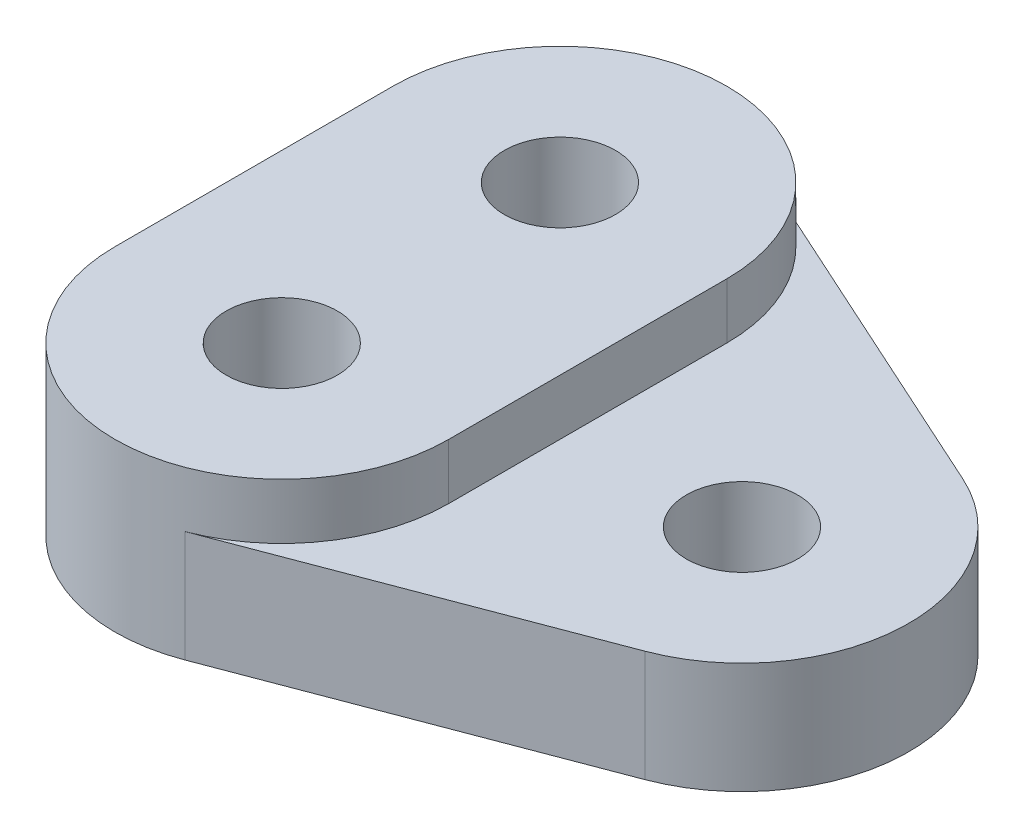
ISO-10303-21;
HEADER;
FILE_DESCRIPTION(('STEP AP214'),'2;1');
FILE_NAME('part.step','',(''),(''),'','','');
FILE_SCHEMA(('AUTOMOTIVE_DESIGN { 1 0 10303 214 1 1 1 1 }'));
ENDSEC;
DATA;
#1=APPLICATION_CONTEXT('core data for automotive mechanical design processes');
#2=APPLICATION_PROTOCOL_DEFINITION('international standard','automotive_design',2000,#1);
#3=PRODUCT_CONTEXT('',#1,'mechanical');
#4=PRODUCT('Part','Part','',(#3));
#5=PRODUCT_RELATED_PRODUCT_CATEGORY('part','',(#4));
#6=PRODUCT_DEFINITION_FORMATION('','',#4);
#7=PRODUCT_DEFINITION_CONTEXT('part definition',#1,'design');
#8=PRODUCT_DEFINITION('design','',#6,#7);
#9=PRODUCT_DEFINITION_SHAPE('','',#8);
#10=(LENGTH_UNIT() NAMED_UNIT(*) SI_UNIT(.MILLI.,.METRE.));
#11=(NAMED_UNIT(*) PLANE_ANGLE_UNIT() SI_UNIT($,.RADIAN.));
#12=(NAMED_UNIT(*) SI_UNIT($,.STERADIAN.) SOLID_ANGLE_UNIT());
#13=UNCERTAINTY_MEASURE_WITH_UNIT(LENGTH_MEASURE(1.E-05),#10,'distance_accuracy_value','');
#14=(GEOMETRIC_REPRESENTATION_CONTEXT(3) GLOBAL_UNCERTAINTY_ASSIGNED_CONTEXT((#13)) GLOBAL_UNIT_ASSIGNED_CONTEXT((#10,
#11,#12)) REPRESENTATION_CONTEXT('',''));
#15=CARTESIAN_POINT('',(0.,0.,0.));
#16=DIRECTION('',(0.,0.,1.));
#17=DIRECTION('',(1.,0.,0.));
#18=AXIS2_PLACEMENT_3D('',#15,#16,#17);
#19=CARTESIAN_POINT('',(2.12569775536231,4.,5.61082962251106));
#20=DIRECTION('',(-0.354282959227052,0.,-0.93513827041851));
#21=DIRECTION('',(-0.93513827041851,0.,0.354282959227052));
#22=AXIS2_PLACEMENT_3D('',#19,#20,#21);
#23=PLANE('',#22);
#24=DIRECTION('',(0.93513827041851,0.,-0.354282959227052));
#25=VECTOR('',#24,1.);
#26=CARTESIAN_POINT('',(2.12569775536231,0.,5.61082962251106));
#27=LINE('',#26,#25);
#28=CARTESIAN_POINT('',(2.12569775536231,0.,5.61082962251106));
#29=VERTEX_POINT('',#28);
#30=CARTESIAN_POINT('',(14.1256977553623,0.,1.06455486806008));
#31=VERTEX_POINT('',#30);
#32=EDGE_CURVE('E121',#29,#31,#27,.T.);
#33=ORIENTED_EDGE('',*,*,#32,.T.);
#34=DIRECTION('',(0.,-1.,0.));
#35=VECTOR('',#34,1.);
#36=CARTESIAN_POINT('',(14.1256977553623,4.,1.06455486806008));
#37=LINE('',#36,#35);
#38=CARTESIAN_POINT('',(14.1256977553623,4.,1.06455486806008));
#39=VERTEX_POINT('',#38);
#40=EDGE_CURVE('E38',#39,#31,#37,.T.);
#41=ORIENTED_EDGE('',*,*,#40,.F.);
#42=DIRECTION('',(0.93513827041851,0.,-0.354282959227052));
#43=VECTOR('',#42,1.);
#44=CARTESIAN_POINT('',(2.12569775536231,4.,5.61082962251106));
#45=LINE('',#44,#43);
#46=CARTESIAN_POINT('',(2.12569775536231,4.,5.61082962251106));
#47=VERTEX_POINT('',#46);
#48=EDGE_CURVE('E130',#47,#39,#45,.T.);
#49=ORIENTED_EDGE('',*,*,#48,.F.);
#50=DIRECTION('',(0.,-1.,0.));
#51=VECTOR('',#50,1.);
#52=CARTESIAN_POINT('',(2.12569775536231,4.,5.61082962251106));
#53=LINE('',#52,#51);
#54=EDGE_CURVE('E141',#47,#29,#53,.T.);
#55=ORIENTED_EDGE('',*,*,#54,.T.);
#56=EDGE_LOOP('',(#33,#41,#49,#55));
#57=FACE_BOUND('',#56,.T.);
#58=ADVANCED_FACE('F35',(#57),#23,.F.);
#59=CARTESIAN_POINT('',(12.,4.,-4.54627475445098));
#60=DIRECTION('',(0.,-1.,0.));
#61=DIRECTION('',(0.,0.,-1.));
#62=AXIS2_PLACEMENT_3D('',#59,#60,#61);
#63=CYLINDRICAL_SURFACE('',#62,6.);
#64=CARTESIAN_POINT('',(12.,0.,-4.54627475445098));
#65=DIRECTION('',(0.,1.,0.));
#66=DIRECTION('',(0.,0.,1.));
#67=AXIS2_PLACEMENT_3D('',#64,#65,#66);
#68=CIRCLE('',#67,6.);
#69=CARTESIAN_POINT('',(14.4825082374739,0.,-10.008614257894));
#70=VERTEX_POINT('',#69);
#71=EDGE_CURVE('E125',#31,#70,#68,.T.);
#72=ORIENTED_EDGE('',*,*,#71,.T.);
#73=DIRECTION('',(0.,-1.,0.));
#74=VECTOR('',#73,1.);
#75=CARTESIAN_POINT('',(14.4825082374739,4.,-10.008614257894));
#76=LINE('',#75,#74);
#77=CARTESIAN_POINT('',(14.4825082374739,4.,-10.008614257894));
#78=VERTEX_POINT('',#77);
#79=EDGE_CURVE('E169',#78,#70,#76,.T.);
#80=ORIENTED_EDGE('',*,*,#79,.F.);
#81=CARTESIAN_POINT('',(12.,4.,-4.54627475445098));
#82=DIRECTION('',(0.,1.,0.));
#83=DIRECTION('',(0.,0.,1.));
#84=AXIS2_PLACEMENT_3D('',#81,#82,#83);
#85=CIRCLE('',#84,6.);
#86=EDGE_CURVE('E133',#39,#78,#85,.T.);
#87=ORIENTED_EDGE('',*,*,#86,.F.);
#88=ORIENTED_EDGE('',*,*,#40,.T.);
#89=EDGE_LOOP('',(#72,#80,#87,#88));
#90=FACE_BOUND('',#89,.T.);
#91=ADVANCED_FACE('F176',(#90),#63,.T.);
#92=CARTESIAN_POINT('',(6.24925901891181,4.,-13.7504375175747));
#93=DIRECTION('',(0.413751372912318,0.,-0.910389917240504));
#94=DIRECTION('',(-0.910389917240504,0.,-0.413751372912318));
#95=AXIS2_PLACEMENT_3D('',#92,#93,#94);
#96=PLANE('',#95);
#97=DIRECTION('',(0.910389917240504,0.,0.413751372912318));
#98=VECTOR('',#97,1.);
#99=CARTESIAN_POINT('',(6.24925901891181,0.,-13.7504375175747));
#100=LINE('',#99,#98);
#101=CARTESIAN_POINT('',(2.48250823747391,0.,-15.462339503443));
#102=VERTEX_POINT('',#101);
#103=EDGE_CURVE('E145',#102,#70,#100,.T.);
#104=ORIENTED_EDGE('',*,*,#103,.F.);
#105=DIRECTION('',(0.,-1.,0.));
#106=VECTOR('',#105,1.);
#107=CARTESIAN_POINT('',(2.48250823747391,4.,-15.462339503443));
#108=LINE('',#107,#106);
#109=CARTESIAN_POINT('',(2.48250823747391,4.,-15.462339503443));
#110=VERTEX_POINT('',#109);
#111=EDGE_CURVE('E168',#110,#102,#108,.T.);
#112=ORIENTED_EDGE('',*,*,#111,.F.);
#113=DIRECTION('',(0.910389917240504,0.,0.413751372912318));
#114=VECTOR('',#113,1.);
#115=CARTESIAN_POINT('',(6.24925901891181,4.,-13.7504375175747));
#116=LINE('',#115,#114);
#117=EDGE_CURVE('E136',#110,#78,#116,.T.);
#118=ORIENTED_EDGE('',*,*,#117,.T.);
#119=ORIENTED_EDGE('',*,*,#79,.T.);
#120=EDGE_LOOP('',(#104,#112,#118,#119));
#121=FACE_BOUND('',#120,.T.);
#122=ADVANCED_FACE('F187',(#121),#96,.T.);
#123=CARTESIAN_POINT('',(0.,4.,-10.));
#124=DIRECTION('',(0.,-1.,0.));
#125=DIRECTION('',(0.,0.,-1.));
#126=AXIS2_PLACEMENT_3D('',#123,#124,#125);
#127=CYLINDRICAL_SURFACE('',#126,6.);
#128=CARTESIAN_POINT('',(0.,0.,-10.));
#129=DIRECTION('',(0.,1.,0.));
#130=DIRECTION('',(0.,0.,1.));
#131=AXIS2_PLACEMENT_3D('',#128,#129,#130);
#132=CIRCLE('',#131,6.);
#133=CARTESIAN_POINT('',(-6.,0.,-10.));
#134=VERTEX_POINT('',#133);
#135=EDGE_CURVE('E148',#102,#134,#132,.T.);
#136=ORIENTED_EDGE('',*,*,#135,.T.);
#137=DIRECTION('',(0.,-1.,0.));
#138=VECTOR('',#137,1.);
#139=CARTESIAN_POINT('',(-6.,4.,-10.));
#140=LINE('',#139,#138);
#141=CARTESIAN_POINT('',(-6.,6.,-10.));
#142=VERTEX_POINT('',#141);
#143=EDGE_CURVE('E104',#142,#134,#140,.T.);
#144=ORIENTED_EDGE('',*,*,#143,.F.);
#145=CARTESIAN_POINT('',(0.,6.,-10.));
#146=DIRECTION('',(0.,1.,0.));
#147=DIRECTION('',(0.,0.,1.));
#148=AXIS2_PLACEMENT_3D('',#145,#146,#147);
#149=CIRCLE('',#148,6.);
#150=CARTESIAN_POINT('',(6.,6.,-10.));
#151=VERTEX_POINT('',#150);
#152=EDGE_CURVE('E98',#151,#142,#149,.T.);
#153=ORIENTED_EDGE('',*,*,#152,.F.);
#154=DIRECTION('',(0.,-1.,0.));
#155=VECTOR('',#154,1.);
#156=CARTESIAN_POINT('',(6.,6.,-10.));
#157=LINE('',#156,#155);
#158=CARTESIAN_POINT('',(6.,4.,-10.));
#159=VERTEX_POINT('',#158);
#160=EDGE_CURVE('E102',#151,#159,#157,.T.);
#161=ORIENTED_EDGE('',*,*,#160,.T.);
#162=CARTESIAN_POINT('',(0.,4.,-10.));
#163=DIRECTION('',(0.,1.,0.));
#164=DIRECTION('',(0.,0.,1.));
#165=AXIS2_PLACEMENT_3D('',#162,#163,#164);
#166=CIRCLE('',#165,6.);
#167=EDGE_CURVE('E54',#159,#110,#166,.T.);
#168=ORIENTED_EDGE('',*,*,#167,.T.);
#169=ORIENTED_EDGE('',*,*,#111,.T.);
#170=EDGE_LOOP('',(#136,#144,#153,#161,#168,#169));
#171=FACE_BOUND('',#170,.T.);
#172=ADVANCED_FACE('F100',(#171),#127,.T.);
#173=CARTESIAN_POINT('',(-6.,4.,0.));
#174=DIRECTION('',(1.,0.,0.));
#175=DIRECTION('',(0.,0.,-1.));
#176=AXIS2_PLACEMENT_3D('',#173,#174,#175);
#177=PLANE('',#176);
#178=DIRECTION('',(0.,0.,1.));
#179=VECTOR('',#178,1.);
#180=CARTESIAN_POINT('',(-6.,0.,0.));
#181=LINE('',#180,#179);
#182=CARTESIAN_POINT('',(-6.,0.,0.));
#183=VERTEX_POINT('',#182);
#184=EDGE_CURVE('E150',#134,#183,#181,.T.);
#185=ORIENTED_EDGE('',*,*,#184,.T.);
#186=DIRECTION('',(0.,-1.,0.));
#187=VECTOR('',#186,1.);
#188=CARTESIAN_POINT('',(-6.,4.,0.));
#189=LINE('',#188,#187);
#190=CARTESIAN_POINT('',(-6.,6.,0.));
#191=VERTEX_POINT('',#190);
#192=EDGE_CURVE('E164',#191,#183,#189,.T.);
#193=ORIENTED_EDGE('',*,*,#192,.F.);
#194=DIRECTION('',(0.,0.,1.));
#195=VECTOR('',#194,1.);
#196=CARTESIAN_POINT('',(-6.,6.,0.));
#197=LINE('',#196,#195);
#198=EDGE_CURVE('E108',#142,#191,#197,.T.);
#199=ORIENTED_EDGE('',*,*,#198,.F.);
#200=ORIENTED_EDGE('',*,*,#143,.T.);
#201=EDGE_LOOP('',(#185,#193,#199,#200));
#202=FACE_BOUND('',#201,.T.);
#203=ADVANCED_FACE('F202',(#202),#177,.F.);
#204=CARTESIAN_POINT('',(0.,4.,0.));
#205=DIRECTION('',(0.,-1.,0.));
#206=DIRECTION('',(0.,0.,-1.));
#207=AXIS2_PLACEMENT_3D('',#204,#205,#206);
#208=CYLINDRICAL_SURFACE('',#207,2.);
#209=CARTESIAN_POINT('',(0.,0.,0.));
#210=DIRECTION('',(0.,1.,0.));
#211=DIRECTION('',(0.,0.,1.));
#212=AXIS2_PLACEMENT_3D('',#209,#210,#211);
#213=CIRCLE('',#212,2.);
#214=CARTESIAN_POINT('',(0.,0.,2.));
#215=VERTEX_POINT('',#214);
#216=EDGE_CURVE('E157',#215,#215,#213,.T.);
#217=ORIENTED_EDGE('',*,*,#216,.F.);
#218=EDGE_LOOP('',(#217));
#219=FACE_BOUND('',#218,.T.);
#220=CARTESIAN_POINT('',(0.,6.,0.));
#221=DIRECTION('',(0.,1.,0.));
#222=DIRECTION('',(0.,0.,1.));
#223=AXIS2_PLACEMENT_3D('',#220,#221,#222);
#224=CIRCLE('',#223,2.);
#225=CARTESIAN_POINT('',(0.,6.,2.));
#226=VERTEX_POINT('',#225);
#227=EDGE_CURVE('E195',#226,#226,#224,.F.);
#228=ORIENTED_EDGE('',*,*,#227,.F.);
#229=EDGE_LOOP('',(#228));
#230=FACE_BOUND('',#229,.T.);
#231=ADVANCED_FACE('F204',(#219,#230),#208,.F.);
#232=CARTESIAN_POINT('',(0.,4.,-10.));
#233=DIRECTION('',(0.,-1.,0.));
#234=DIRECTION('',(0.,0.,-1.));
#235=AXIS2_PLACEMENT_3D('',#232,#233,#234);
#236=CYLINDRICAL_SURFACE('',#235,2.);
#237=CARTESIAN_POINT('',(0.,0.,-10.));
#238=DIRECTION('',(0.,1.,0.));
#239=DIRECTION('',(0.,0.,1.));
#240=AXIS2_PLACEMENT_3D('',#237,#238,#239);
#241=CIRCLE('',#240,2.);
#242=CARTESIAN_POINT('',(0.,0.,-8.));
#243=VERTEX_POINT('',#242);
#244=EDGE_CURVE('E154',#243,#243,#241,.T.);
#245=ORIENTED_EDGE('',*,*,#244,.F.);
#246=EDGE_LOOP('',(#245));
#247=FACE_BOUND('',#246,.T.);
#248=CARTESIAN_POINT('',(0.,6.,-10.));
#249=DIRECTION('',(0.,1.,0.));
#250=DIRECTION('',(0.,0.,1.));
#251=AXIS2_PLACEMENT_3D('',#248,#249,#250);
#252=CIRCLE('',#251,2.);
#253=CARTESIAN_POINT('',(0.,6.,-8.));
#254=VERTEX_POINT('',#253);
#255=EDGE_CURVE('E127',#254,#254,#252,.F.);
#256=ORIENTED_EDGE('',*,*,#255,.F.);
#257=EDGE_LOOP('',(#256));
#258=FACE_BOUND('',#257,.T.);
#259=ADVANCED_FACE('F210',(#247,#258),#236,.F.);
#260=CARTESIAN_POINT('',(0.,4.,0.));
#261=DIRECTION('',(0.,-1.,0.));
#262=DIRECTION('',(0.,0.,-1.));
#263=AXIS2_PLACEMENT_3D('',#260,#261,#262);
#264=CYLINDRICAL_SURFACE('',#263,6.);
#265=CARTESIAN_POINT('',(0.,0.,0.));
#266=DIRECTION('',(0.,1.,0.));
#267=DIRECTION('',(0.,0.,1.));
#268=AXIS2_PLACEMENT_3D('',#265,#266,#267);
#269=CIRCLE('',#268,6.);
#270=EDGE_CURVE('E152',#183,#29,#269,.T.);
#271=ORIENTED_EDGE('',*,*,#270,.T.);
#272=ORIENTED_EDGE('',*,*,#54,.F.);
#273=CARTESIAN_POINT('',(0.,4.,0.));
#274=DIRECTION('',(0.,1.,0.));
#275=DIRECTION('',(0.,0.,1.));
#276=AXIS2_PLACEMENT_3D('',#273,#274,#275);
#277=CIRCLE('',#276,6.);
#278=CARTESIAN_POINT('',(6.,4.,0.));
#279=VERTEX_POINT('',#278);
#280=EDGE_CURVE('E11',#47,#279,#277,.T.);
#281=ORIENTED_EDGE('',*,*,#280,.T.);
#282=DIRECTION('',(0.,-1.,0.));
#283=VECTOR('',#282,1.);
#284=CARTESIAN_POINT('',(6.,6.,0.));
#285=LINE('',#284,#283);
#286=CARTESIAN_POINT('',(6.,6.,0.));
#287=VERTEX_POINT('',#286);
#288=EDGE_CURVE('E122',#287,#279,#285,.T.);
#289=ORIENTED_EDGE('',*,*,#288,.F.);
#290=CARTESIAN_POINT('',(0.,6.,0.));
#291=DIRECTION('',(0.,1.,0.));
#292=DIRECTION('',(0.,0.,1.));
#293=AXIS2_PLACEMENT_3D('',#290,#291,#292);
#294=CIRCLE('',#293,6.);
#295=EDGE_CURVE('E115',#191,#287,#294,.T.);
#296=ORIENTED_EDGE('',*,*,#295,.F.);
#297=ORIENTED_EDGE('',*,*,#192,.T.);
#298=EDGE_LOOP('',(#271,#272,#281,#289,#296,#297));
#299=FACE_BOUND('',#298,.T.);
#300=ADVANCED_FACE('F201',(#299),#264,.T.);
#301=CARTESIAN_POINT('',(12.,4.,-4.54627475445098));
#302=DIRECTION('',(0.,-1.,0.));
#303=DIRECTION('',(0.,0.,-1.));
#304=AXIS2_PLACEMENT_3D('',#301,#302,#303);
#305=CYLINDRICAL_SURFACE('',#304,2.);
#306=CARTESIAN_POINT('',(12.,4.,-4.54627475445098));
#307=DIRECTION('',(0.,1.,0.));
#308=DIRECTION('',(0.,0.,1.));
#309=AXIS2_PLACEMENT_3D('',#306,#307,#308);
#310=CIRCLE('',#309,2.);
#311=CARTESIAN_POINT('',(12.,4.,-2.54627475445098));
#312=VERTEX_POINT('',#311);
#313=EDGE_CURVE('E139',#312,#312,#310,.T.);
#314=ORIENTED_EDGE('',*,*,#313,.T.);
#315=EDGE_LOOP('',(#314));
#316=FACE_BOUND('',#315,.T.);
#317=CARTESIAN_POINT('',(12.,0.,-4.54627475445098));
#318=DIRECTION('',(0.,1.,0.));
#319=DIRECTION('',(0.,0.,1.));
#320=AXIS2_PLACEMENT_3D('',#317,#318,#319);
#321=CIRCLE('',#320,2.);
#322=CARTESIAN_POINT('',(12.,0.,-2.54627475445098));
#323=VERTEX_POINT('',#322);
#324=EDGE_CURVE('E134',#323,#323,#321,.T.);
#325=ORIENTED_EDGE('',*,*,#324,.F.);
#326=EDGE_LOOP('',(#325));
#327=FACE_BOUND('',#326,.T.);
#328=ADVANCED_FACE('F262',(#316,#327),#305,.F.);
#329=CARTESIAN_POINT('',(0.,4.,0.));
#330=DIRECTION('',(0.,1.,0.));
#331=DIRECTION('',(0.,0.,1.));
#332=AXIS2_PLACEMENT_3D('',#329,#330,#331);
#333=PLANE('',#332);
#334=ORIENTED_EDGE('',*,*,#280,.F.);
#335=ORIENTED_EDGE('',*,*,#48,.T.);
#336=ORIENTED_EDGE('',*,*,#86,.T.);
#337=ORIENTED_EDGE('',*,*,#117,.F.);
#338=ORIENTED_EDGE('',*,*,#167,.F.);
#339=DIRECTION('',(0.,0.,-1.));
#340=VECTOR('',#339,1.);
#341=CARTESIAN_POINT('',(6.,4.,0.));
#342=LINE('',#341,#340);
#343=EDGE_CURVE('E50',#279,#159,#342,.T.);
#344=ORIENTED_EDGE('',*,*,#343,.F.);
#345=EDGE_LOOP('',(#334,#335,#336,#337,#338,#344));
#346=FACE_BOUND('',#345,.T.);
#347=ORIENTED_EDGE('',*,*,#313,.F.);
#348=EDGE_LOOP('',(#347));
#349=FACE_BOUND('',#348,.T.);
#350=ADVANCED_FACE('F188',(#346,#349),#333,.T.);
#351=CARTESIAN_POINT('',(0.,0.,0.));
#352=DIRECTION('',(0.,1.,0.));
#353=DIRECTION('',(0.,0.,1.));
#354=AXIS2_PLACEMENT_3D('',#351,#352,#353);
#355=PLANE('',#354);
#356=ORIENTED_EDGE('',*,*,#32,.F.);
#357=ORIENTED_EDGE('',*,*,#270,.F.);
#358=ORIENTED_EDGE('',*,*,#184,.F.);
#359=ORIENTED_EDGE('',*,*,#135,.F.);
#360=ORIENTED_EDGE('',*,*,#103,.T.);
#361=ORIENTED_EDGE('',*,*,#71,.F.);
#362=EDGE_LOOP('',(#356,#357,#358,#359,#360,#361));
#363=FACE_BOUND('',#362,.T.);
#364=ORIENTED_EDGE('',*,*,#244,.T.);
#365=EDGE_LOOP('',(#364));
#366=FACE_BOUND('',#365,.T.);
#367=ORIENTED_EDGE('',*,*,#216,.T.);
#368=EDGE_LOOP('',(#367));
#369=FACE_BOUND('',#368,.T.);
#370=ORIENTED_EDGE('',*,*,#324,.T.);
#371=EDGE_LOOP('',(#370));
#372=FACE_BOUND('',#371,.T.);
#373=ADVANCED_FACE('F183',(#363,#366,#369,#372),#355,.F.);
#374=CARTESIAN_POINT('',(6.,6.,0.));
#375=DIRECTION('',(-1.,0.,0.));
#376=DIRECTION('',(0.,0.,1.));
#377=AXIS2_PLACEMENT_3D('',#374,#375,#376);
#378=PLANE('',#377);
#379=ORIENTED_EDGE('',*,*,#343,.T.);
#380=ORIENTED_EDGE('',*,*,#160,.F.);
#381=DIRECTION('',(0.,0.,-1.));
#382=VECTOR('',#381,1.);
#383=CARTESIAN_POINT('',(6.,6.,0.));
#384=LINE('',#383,#382);
#385=EDGE_CURVE('E109',#287,#151,#384,.T.);
#386=ORIENTED_EDGE('',*,*,#385,.F.);
#387=ORIENTED_EDGE('',*,*,#288,.T.);
#388=EDGE_LOOP('',(#379,#380,#386,#387));
#389=FACE_BOUND('',#388,.T.);
#390=ADVANCED_FACE('F120',(#389),#378,.F.);
#391=CARTESIAN_POINT('',(0.,6.,0.));
#392=DIRECTION('',(0.,1.,0.));
#393=DIRECTION('',(0.,0.,1.));
#394=AXIS2_PLACEMENT_3D('',#391,#392,#393);
#395=PLANE('',#394);
#396=ORIENTED_EDGE('',*,*,#385,.T.);
#397=ORIENTED_EDGE('',*,*,#152,.T.);
#398=ORIENTED_EDGE('',*,*,#198,.T.);
#399=ORIENTED_EDGE('',*,*,#295,.T.);
#400=EDGE_LOOP('',(#396,#397,#398,#399));
#401=FACE_BOUND('',#400,.T.);
#402=ORIENTED_EDGE('',*,*,#227,.T.);
#403=EDGE_LOOP('',(#402));
#404=FACE_BOUND('',#403,.T.);
#405=ORIENTED_EDGE('',*,*,#255,.T.);
#406=EDGE_LOOP('',(#405));
#407=FACE_BOUND('',#406,.T.);
#408=ADVANCED_FACE('F112',(#401,#404,#407),#395,.T.);
#409=CLOSED_SHELL('',(#58,#91,#122,#172,#203,#231,#259,#300,#328,#350,#373,#390,#408));
#410=MANIFOLD_SOLID_BREP('B2',#409);
#411=ADVANCED_BREP_SHAPE_REPRESENTATION('',(#18,#410),#14);
#412=SHAPE_DEFINITION_REPRESENTATION(#9,#411);
ENDSEC;
END-ISO-10303-21;
